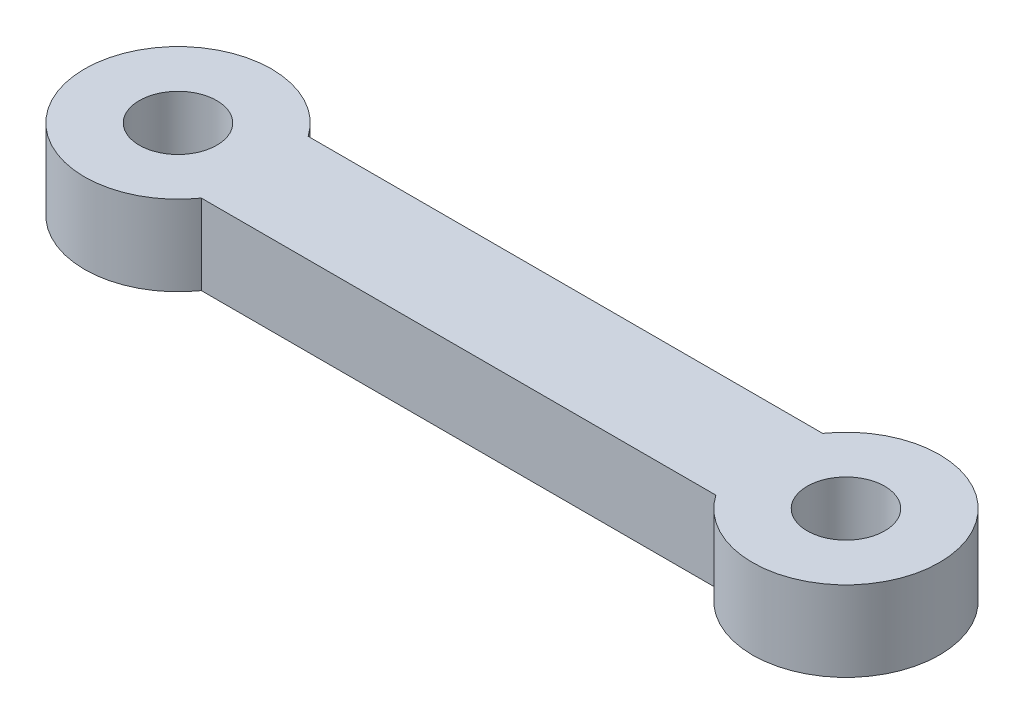
ISO-10303-21;
HEADER;
FILE_DESCRIPTION(('STEP AP214'),'2;1');
FILE_NAME('part.step','',(''),(''),'','','');
FILE_SCHEMA(('AUTOMOTIVE_DESIGN { 1 0 10303 214 1 1 1 1 }'));
ENDSEC;
DATA;
#1=APPLICATION_CONTEXT('core data for automotive mechanical design processes');
#2=APPLICATION_PROTOCOL_DEFINITION('international standard','automotive_design',2000,#1);
#3=PRODUCT_CONTEXT('',#1,'mechanical');
#4=PRODUCT('Part','Part','',(#3));
#5=PRODUCT_RELATED_PRODUCT_CATEGORY('part','',(#4));
#6=PRODUCT_DEFINITION_FORMATION('','',#4);
#7=PRODUCT_DEFINITION_CONTEXT('part definition',#1,'design');
#8=PRODUCT_DEFINITION('design','',#6,#7);
#9=PRODUCT_DEFINITION_SHAPE('','',#8);
#10=(LENGTH_UNIT() NAMED_UNIT(*) SI_UNIT(.MILLI.,.METRE.));
#11=(NAMED_UNIT(*) PLANE_ANGLE_UNIT() SI_UNIT($,.RADIAN.));
#12=(NAMED_UNIT(*) SI_UNIT($,.STERADIAN.) SOLID_ANGLE_UNIT());
#13=UNCERTAINTY_MEASURE_WITH_UNIT(LENGTH_MEASURE(1.E-05),#10,'distance_accuracy_value','');
#14=(GEOMETRIC_REPRESENTATION_CONTEXT(3) GLOBAL_UNCERTAINTY_ASSIGNED_CONTEXT((#13)) GLOBAL_UNIT_ASSIGNED_CONTEXT((#10,
#11,#12)) REPRESENTATION_CONTEXT('',''));
#15=CARTESIAN_POINT('',(0.,0.,0.));
#16=DIRECTION('',(0.,0.,1.));
#17=DIRECTION('',(1.,0.,0.));
#18=AXIS2_PLACEMENT_3D('',#15,#16,#17);
#19=CARTESIAN_POINT('',(0.,3.81,2.54));
#20=DIRECTION('',(0.,0.,-1.));
#21=DIRECTION('',(-1.,0.,0.));
#22=AXIS2_PLACEMENT_3D('',#19,#20,#21);
#23=PLANE('',#22);
#24=DIRECTION('',(1.,0.,0.));
#25=VECTOR('',#24,1.);
#26=CARTESIAN_POINT('',(0.,0.,2.54));
#27=LINE('',#26,#25);
#28=CARTESIAN_POINT('',(3.64779728055165,0.,2.54));
#29=VERTEX_POINT('',#28);
#30=CARTESIAN_POINT('',(28.1022027194484,0.,2.54));
#31=VERTEX_POINT('',#30);
#32=EDGE_CURVE('E105',#29,#31,#27,.T.);
#33=ORIENTED_EDGE('',*,*,#32,.T.);
#34=DIRECTION('',(0.,-1.,0.));
#35=VECTOR('',#34,1.);
#36=CARTESIAN_POINT('',(28.1022027194484,3.81,2.54));
#37=LINE('',#36,#35);
#38=CARTESIAN_POINT('',(28.1022027194484,3.81,2.54));
#39=VERTEX_POINT('',#38);
#40=EDGE_CURVE('E11',#39,#31,#37,.T.);
#41=ORIENTED_EDGE('',*,*,#40,.F.);
#42=DIRECTION('',(1.,0.,0.));
#43=VECTOR('',#42,1.);
#44=CARTESIAN_POINT('',(0.,3.81,2.54));
#45=LINE('',#44,#43);
#46=CARTESIAN_POINT('',(3.64779728055165,3.81,2.54));
#47=VERTEX_POINT('',#46);
#48=EDGE_CURVE('E84',#47,#39,#45,.T.);
#49=ORIENTED_EDGE('',*,*,#48,.F.);
#50=DIRECTION('',(0.,-1.,0.));
#51=VECTOR('',#50,1.);
#52=CARTESIAN_POINT('',(3.64779728055165,3.81,2.54));
#53=LINE('',#52,#51);
#54=EDGE_CURVE('E95',#47,#29,#53,.T.);
#55=ORIENTED_EDGE('',*,*,#54,.T.);
#56=EDGE_LOOP('',(#33,#41,#49,#55));
#57=FACE_BOUND('',#56,.T.);
#58=ADVANCED_FACE('F36',(#57),#23,.F.);
#59=CARTESIAN_POINT('',(31.75,3.81,0.));
#60=DIRECTION('',(0.,-1.,0.));
#61=DIRECTION('',(0.,0.,-1.));
#62=AXIS2_PLACEMENT_3D('',#59,#60,#61);
#63=CYLINDRICAL_SURFACE('',#62,4.445);
#64=CARTESIAN_POINT('',(31.75,0.,0.));
#65=DIRECTION('',(0.,1.,0.));
#66=DIRECTION('',(0.,0.,1.));
#67=AXIS2_PLACEMENT_3D('',#64,#65,#66);
#68=CIRCLE('',#67,4.445);
#69=CARTESIAN_POINT('',(28.1022027194484,0.,-2.54));
#70=VERTEX_POINT('',#69);
#71=EDGE_CURVE('E89',#31,#70,#68,.T.);
#72=ORIENTED_EDGE('',*,*,#71,.T.);
#73=DIRECTION('',(0.,-1.,0.));
#74=VECTOR('',#73,1.);
#75=CARTESIAN_POINT('',(28.1022027194484,3.81,-2.54));
#76=LINE('',#75,#74);
#77=CARTESIAN_POINT('',(28.1022027194484,3.81,-2.54));
#78=VERTEX_POINT('',#77);
#79=EDGE_CURVE('E45',#78,#70,#76,.T.);
#80=ORIENTED_EDGE('',*,*,#79,.F.);
#81=CARTESIAN_POINT('',(31.75,3.81,0.));
#82=DIRECTION('',(0.,1.,0.));
#83=DIRECTION('',(0.,0.,1.));
#84=AXIS2_PLACEMENT_3D('',#81,#82,#83);
#85=CIRCLE('',#84,4.445);
#86=EDGE_CURVE('E79',#39,#78,#85,.T.);
#87=ORIENTED_EDGE('',*,*,#86,.F.);
#88=ORIENTED_EDGE('',*,*,#40,.T.);
#89=EDGE_LOOP('',(#72,#80,#87,#88));
#90=FACE_BOUND('',#89,.T.);
#91=ADVANCED_FACE('F88',(#90),#63,.T.);
#92=CARTESIAN_POINT('',(0.,3.81,-2.54));
#93=DIRECTION('',(0.,0.,-1.));
#94=DIRECTION('',(-1.,0.,0.));
#95=AXIS2_PLACEMENT_3D('',#92,#93,#94);
#96=PLANE('',#95);
#97=DIRECTION('',(1.,0.,0.));
#98=VECTOR('',#97,1.);
#99=CARTESIAN_POINT('',(0.,0.,-2.54));
#100=LINE('',#99,#98);
#101=CARTESIAN_POINT('',(3.64779728055165,0.,-2.54));
#102=VERTEX_POINT('',#101);
#103=EDGE_CURVE('E109',#102,#70,#100,.T.);
#104=ORIENTED_EDGE('',*,*,#103,.F.);
#105=DIRECTION('',(0.,-1.,0.));
#106=VECTOR('',#105,1.);
#107=CARTESIAN_POINT('',(3.64779728055165,3.81,-2.54));
#108=LINE('',#107,#106);
#109=CARTESIAN_POINT('',(3.64779728055165,3.81,-2.54));
#110=VERTEX_POINT('',#109);
#111=EDGE_CURVE('E69',#110,#102,#108,.T.);
#112=ORIENTED_EDGE('',*,*,#111,.F.);
#113=DIRECTION('',(1.,0.,0.));
#114=VECTOR('',#113,1.);
#115=CARTESIAN_POINT('',(0.,3.81,-2.54));
#116=LINE('',#115,#114);
#117=EDGE_CURVE('E82',#110,#78,#116,.T.);
#118=ORIENTED_EDGE('',*,*,#117,.T.);
#119=ORIENTED_EDGE('',*,*,#79,.T.);
#120=EDGE_LOOP('',(#104,#112,#118,#119));
#121=FACE_BOUND('',#120,.T.);
#122=ADVANCED_FACE('F93',(#121),#96,.T.);
#123=CARTESIAN_POINT('',(0.,3.81,0.));
#124=DIRECTION('',(0.,-1.,0.));
#125=DIRECTION('',(0.,0.,-1.));
#126=AXIS2_PLACEMENT_3D('',#123,#124,#125);
#127=CYLINDRICAL_SURFACE('',#126,1.8415);
#128=CARTESIAN_POINT('',(0.,3.81,0.));
#129=DIRECTION('',(0.,1.,0.));
#130=DIRECTION('',(0.,0.,1.));
#131=AXIS2_PLACEMENT_3D('',#128,#129,#130);
#132=CIRCLE('',#131,1.8415);
#133=CARTESIAN_POINT('',(0.,3.81,-1.8415));
#134=VERTEX_POINT('',#133);
#135=EDGE_CURVE('E147',#134,#134,#132,.T.);
#136=CARTESIAN_POINT('',(0.,0.,0.));
#137=DIRECTION('',(0.,1.,0.));
#138=DIRECTION('',(0.,0.,1.));
#139=AXIS2_PLACEMENT_3D('',#136,#137,#138);
#140=CIRCLE('',#139,1.8415);
#141=CARTESIAN_POINT('',(0.,0.,-1.8415));
#142=VERTEX_POINT('',#141);
#143=EDGE_CURVE('E102',#142,#142,#140,.T.);
#144=CARTESIAN_POINT('',(0.,3.81,-1.8415));
#145=CARTESIAN_POINT('',(0.,3.7703125,-1.8415));
#146=CARTESIAN_POINT('',(0.,3.730625,-1.8415));
#147=CARTESIAN_POINT('',(0.,3.65125,-1.8415));
#148=CARTESIAN_POINT('',(0.,3.6115625,-1.8415));
#149=CARTESIAN_POINT('',(0.,3.5321875,-1.8415));
#150=CARTESIAN_POINT('',(0.,3.4925,-1.8415));
#151=CARTESIAN_POINT('',(0.,3.413125,-1.8415));
#152=CARTESIAN_POINT('',(0.,3.3734375,-1.8415));
#153=CARTESIAN_POINT('',(0.,3.2940625,-1.8415));
#154=CARTESIAN_POINT('',(0.,3.254375,-1.8415));
#155=CARTESIAN_POINT('',(0.,3.175,-1.8415));
#156=CARTESIAN_POINT('',(0.,3.1353125,-1.8415));
#157=CARTESIAN_POINT('',(0.,3.0559375,-1.8415));
#158=CARTESIAN_POINT('',(0.,3.01625,-1.8415));
#159=CARTESIAN_POINT('',(0.,2.936875,-1.8415));
#160=CARTESIAN_POINT('',(0.,2.8971875,-1.8415));
#161=CARTESIAN_POINT('',(0.,2.8178125,-1.8415));
#162=CARTESIAN_POINT('',(0.,2.778125,-1.8415));
#163=CARTESIAN_POINT('',(0.,2.69875,-1.8415));
#164=CARTESIAN_POINT('',(0.,2.6590625,-1.8415));
#165=CARTESIAN_POINT('',(0.,2.5796875,-1.8415));
#166=CARTESIAN_POINT('',(0.,2.54,-1.8415));
#167=CARTESIAN_POINT('',(0.,2.460625,-1.8415));
#168=CARTESIAN_POINT('',(0.,2.4209375,-1.8415));
#169=CARTESIAN_POINT('',(0.,2.3415625,-1.8415));
#170=CARTESIAN_POINT('',(0.,2.301875,-1.8415));
#171=CARTESIAN_POINT('',(0.,2.2225,-1.8415));
#172=CARTESIAN_POINT('',(0.,2.1828125,-1.8415));
#173=CARTESIAN_POINT('',(0.,2.1034375,-1.8415));
#174=CARTESIAN_POINT('',(0.,2.06375,-1.8415));
#175=CARTESIAN_POINT('',(0.,1.984375,-1.8415));
#176=CARTESIAN_POINT('',(0.,1.9446875,-1.8415));
#177=CARTESIAN_POINT('',(0.,1.8653125,-1.8415));
#178=CARTESIAN_POINT('',(0.,1.825625,-1.8415));
#179=CARTESIAN_POINT('',(0.,1.74625,-1.8415));
#180=CARTESIAN_POINT('',(0.,1.7065625,-1.8415));
#181=CARTESIAN_POINT('',(0.,1.6271875,-1.8415));
#182=CARTESIAN_POINT('',(0.,1.5875,-1.8415));
#183=CARTESIAN_POINT('',(0.,1.508125,-1.8415));
#184=CARTESIAN_POINT('',(0.,1.4684375,-1.8415));
#185=CARTESIAN_POINT('',(0.,1.3890625,-1.8415));
#186=CARTESIAN_POINT('',(0.,1.349375,-1.8415));
#187=CARTESIAN_POINT('',(0.,1.27,-1.8415));
#188=CARTESIAN_POINT('',(0.,1.2303125,-1.8415));
#189=CARTESIAN_POINT('',(0.,1.1509375,-1.8415));
#190=CARTESIAN_POINT('',(0.,1.11125,-1.8415));
#191=CARTESIAN_POINT('',(0.,1.031875,-1.8415));
#192=CARTESIAN_POINT('',(0.,0.9921875,-1.8415));
#193=CARTESIAN_POINT('',(0.,0.9128125,-1.8415));
#194=CARTESIAN_POINT('',(0.,0.873125,-1.8415));
#195=CARTESIAN_POINT('',(0.,0.79375,-1.8415));
#196=CARTESIAN_POINT('',(0.,0.7540625,-1.8415));
#197=CARTESIAN_POINT('',(0.,0.6746875,-1.8415));
#198=CARTESIAN_POINT('',(0.,0.635,-1.8415));
#199=CARTESIAN_POINT('',(0.,0.555625,-1.8415));
#200=CARTESIAN_POINT('',(0.,0.5159375,-1.8415));
#201=CARTESIAN_POINT('',(0.,0.4365625,-1.8415));
#202=CARTESIAN_POINT('',(0.,0.396875,-1.8415));
#203=CARTESIAN_POINT('',(0.,0.3175,-1.8415));
#204=CARTESIAN_POINT('',(0.,0.2778125,-1.8415));
#205=CARTESIAN_POINT('',(0.,0.1984375,-1.8415));
#206=CARTESIAN_POINT('',(0.,0.15875,-1.8415));
#207=CARTESIAN_POINT('',(0.,0.0793749999999999,-1.8415));
#208=CARTESIAN_POINT('',(0.,0.0396874999999999,-1.8415));
#209=CARTESIAN_POINT('',(0.,0.,-1.8415));
#210=B_SPLINE_CURVE_WITH_KNOTS('',3,(#144,#145,#146,#147,#148,#149,#150,#151,#152,#153,#154,
#155,#156,#157,#158,#159,#160,#161,#162,#163,#164,#165,#166,#167,#168,#169,#170,#171,#172,#173,
#174,#175,#176,#177,#178,#179,#180,#181,#182,#183,#184,#185,#186,#187,#188,#189,#190,#191,#192,
#193,#194,#195,#196,#197,#198,#199,#200,#201,#202,#203,#204,#205,#206,#207,#208,#209),
.UNSPECIFIED.,.F.,.F.,(4,2,2,2,2,2,2,2,2,2,2,2,2,2,2,2,2,2,2,2,2,2,2,2,2,2,2,2,2,2,2,2,4),(0.,
0.1190625,0.238125,0.3571875,0.47625,0.5953125,0.714375,0.8334375,0.9525,1.0715625,1.190625,
1.3096875,1.42875,1.5478125,1.666875,1.7859375,1.905,2.0240625,2.143125,2.2621875,2.38125,
2.5003125,2.619375,2.7384375,2.8575,2.9765625,3.095625,3.2146875,3.33375,3.4528125,3.571875,
3.6909375,3.81),.UNSPECIFIED.);
#211=EDGE_CURVE('BSEAM136',#134,#142,#210,.T.);
#212=ORIENTED_EDGE('',*,*,#135,.T.);
#213=ORIENTED_EDGE('',*,*,#143,.F.);
#214=ORIENTED_EDGE('',*,*,#211,.T.);
#215=ORIENTED_EDGE('',*,*,#211,.F.);
#216=EDGE_LOOP('',(#212,#214,#213,#215));
#217=FACE_BOUND('',#216,.T.);
#218=ADVANCED_FACE('F136',(#217),#127,.F.);
#219=CARTESIAN_POINT('',(31.75,3.81,0.));
#220=DIRECTION('',(0.,-1.,0.));
#221=DIRECTION('',(0.,0.,-1.));
#222=AXIS2_PLACEMENT_3D('',#219,#220,#221);
#223=CYLINDRICAL_SURFACE('',#222,1.8415);
#224=CARTESIAN_POINT('',(31.75,3.81,0.));
#225=DIRECTION('',(0.,1.,0.));
#226=DIRECTION('',(0.,0.,1.));
#227=AXIS2_PLACEMENT_3D('',#224,#225,#226);
#228=CIRCLE('',#227,1.8415);
#229=CARTESIAN_POINT('',(31.75,3.81,-1.8415));
#230=VERTEX_POINT('',#229);
#231=EDGE_CURVE('E112',#230,#230,#228,.T.);
#232=CARTESIAN_POINT('',(31.75,0.,0.));
#233=DIRECTION('',(0.,1.,0.));
#234=DIRECTION('',(0.,0.,1.));
#235=AXIS2_PLACEMENT_3D('',#232,#233,#234);
#236=CIRCLE('',#235,1.8415);
#237=CARTESIAN_POINT('',(31.75,0.,-1.8415));
#238=VERTEX_POINT('',#237);
#239=EDGE_CURVE('E99',#238,#238,#236,.T.);
#240=CARTESIAN_POINT('',(31.75,3.81,-1.8415));
#241=CARTESIAN_POINT('',(31.75,3.7703125,-1.8415));
#242=CARTESIAN_POINT('',(31.75,3.730625,-1.8415));
#243=CARTESIAN_POINT('',(31.75,3.65125,-1.8415));
#244=CARTESIAN_POINT('',(31.75,3.6115625,-1.8415));
#245=CARTESIAN_POINT('',(31.75,3.5321875,-1.8415));
#246=CARTESIAN_POINT('',(31.75,3.4925,-1.8415));
#247=CARTESIAN_POINT('',(31.75,3.413125,-1.8415));
#248=CARTESIAN_POINT('',(31.75,3.3734375,-1.8415));
#249=CARTESIAN_POINT('',(31.75,3.2940625,-1.8415));
#250=CARTESIAN_POINT('',(31.75,3.254375,-1.8415));
#251=CARTESIAN_POINT('',(31.75,3.175,-1.8415));
#252=CARTESIAN_POINT('',(31.75,3.1353125,-1.8415));
#253=CARTESIAN_POINT('',(31.75,3.0559375,-1.8415));
#254=CARTESIAN_POINT('',(31.75,3.01625,-1.8415));
#255=CARTESIAN_POINT('',(31.75,2.936875,-1.8415));
#256=CARTESIAN_POINT('',(31.75,2.8971875,-1.8415));
#257=CARTESIAN_POINT('',(31.75,2.8178125,-1.8415));
#258=CARTESIAN_POINT('',(31.75,2.778125,-1.8415));
#259=CARTESIAN_POINT('',(31.75,2.69875,-1.8415));
#260=CARTESIAN_POINT('',(31.75,2.6590625,-1.8415));
#261=CARTESIAN_POINT('',(31.75,2.5796875,-1.8415));
#262=CARTESIAN_POINT('',(31.75,2.54,-1.8415));
#263=CARTESIAN_POINT('',(31.75,2.460625,-1.8415));
#264=CARTESIAN_POINT('',(31.75,2.4209375,-1.8415));
#265=CARTESIAN_POINT('',(31.75,2.3415625,-1.8415));
#266=CARTESIAN_POINT('',(31.75,2.301875,-1.8415));
#267=CARTESIAN_POINT('',(31.75,2.2225,-1.8415));
#268=CARTESIAN_POINT('',(31.75,2.1828125,-1.8415));
#269=CARTESIAN_POINT('',(31.75,2.1034375,-1.8415));
#270=CARTESIAN_POINT('',(31.75,2.06375,-1.8415));
#271=CARTESIAN_POINT('',(31.75,1.984375,-1.8415));
#272=CARTESIAN_POINT('',(31.75,1.9446875,-1.8415));
#273=CARTESIAN_POINT('',(31.75,1.8653125,-1.8415));
#274=CARTESIAN_POINT('',(31.75,1.825625,-1.8415));
#275=CARTESIAN_POINT('',(31.75,1.74625,-1.8415));
#276=CARTESIAN_POINT('',(31.75,1.7065625,-1.8415));
#277=CARTESIAN_POINT('',(31.75,1.6271875,-1.8415));
#278=CARTESIAN_POINT('',(31.75,1.5875,-1.8415));
#279=CARTESIAN_POINT('',(31.75,1.508125,-1.8415));
#280=CARTESIAN_POINT('',(31.75,1.4684375,-1.8415));
#281=CARTESIAN_POINT('',(31.75,1.3890625,-1.8415));
#282=CARTESIAN_POINT('',(31.75,1.349375,-1.8415));
#283=CARTESIAN_POINT('',(31.75,1.27,-1.8415));
#284=CARTESIAN_POINT('',(31.75,1.2303125,-1.8415));
#285=CARTESIAN_POINT('',(31.75,1.1509375,-1.8415));
#286=CARTESIAN_POINT('',(31.75,1.11125,-1.8415));
#287=CARTESIAN_POINT('',(31.75,1.031875,-1.8415));
#288=CARTESIAN_POINT('',(31.75,0.9921875,-1.8415));
#289=CARTESIAN_POINT('',(31.75,0.9128125,-1.8415));
#290=CARTESIAN_POINT('',(31.75,0.873125,-1.8415));
#291=CARTESIAN_POINT('',(31.75,0.79375,-1.8415));
#292=CARTESIAN_POINT('',(31.75,0.7540625,-1.8415));
#293=CARTESIAN_POINT('',(31.75,0.6746875,-1.8415));
#294=CARTESIAN_POINT('',(31.75,0.635,-1.8415));
#295=CARTESIAN_POINT('',(31.75,0.555625,-1.8415));
#296=CARTESIAN_POINT('',(31.75,0.5159375,-1.8415));
#297=CARTESIAN_POINT('',(31.75,0.4365625,-1.8415));
#298=CARTESIAN_POINT('',(31.75,0.396875,-1.8415));
#299=CARTESIAN_POINT('',(31.75,0.3175,-1.8415));
#300=CARTESIAN_POINT('',(31.75,0.2778125,-1.8415));
#301=CARTESIAN_POINT('',(31.75,0.1984375,-1.8415));
#302=CARTESIAN_POINT('',(31.75,0.15875,-1.8415));
#303=CARTESIAN_POINT('',(31.75,0.0793749999999999,-1.8415));
#304=CARTESIAN_POINT('',(31.75,0.0396874999999999,-1.8415));
#305=CARTESIAN_POINT('',(31.75,0.,-1.8415));
#306=B_SPLINE_CURVE_WITH_KNOTS('',3,(#240,#241,#242,#243,#244,#245,#246,#247,#248,#249,#250,
#251,#252,#253,#254,#255,#256,#257,#258,#259,#260,#261,#262,#263,#264,#265,#266,#267,#268,#269,
#270,#271,#272,#273,#274,#275,#276,#277,#278,#279,#280,#281,#282,#283,#284,#285,#286,#287,#288,
#289,#290,#291,#292,#293,#294,#295,#296,#297,#298,#299,#300,#301,#302,#303,#304,#305),
.UNSPECIFIED.,.F.,.F.,(4,2,2,2,2,2,2,2,2,2,2,2,2,2,2,2,2,2,2,2,2,2,2,2,2,2,2,2,2,2,2,2,4),(0.,
0.1190625,0.238125,0.3571875,0.47625,0.5953125,0.714375,0.8334375,0.9525,1.0715625,1.190625,
1.3096875,1.42875,1.5478125,1.666875,1.7859375,1.905,2.0240625,2.143125,2.2621875,2.38125,
2.5003125,2.619375,2.7384375,2.8575,2.9765625,3.095625,3.2146875,3.33375,3.4528125,3.571875,
3.6909375,3.81),.UNSPECIFIED.);
#307=EDGE_CURVE('BSEAM38',#230,#238,#306,.T.);
#308=ORIENTED_EDGE('',*,*,#231,.T.);
#309=ORIENTED_EDGE('',*,*,#239,.F.);
#310=ORIENTED_EDGE('',*,*,#307,.T.);
#311=ORIENTED_EDGE('',*,*,#307,.F.);
#312=EDGE_LOOP('',(#308,#310,#309,#311));
#313=FACE_BOUND('',#312,.T.);
#314=ADVANCED_FACE('F38',(#313),#223,.F.);
#315=CARTESIAN_POINT('',(0.,3.81,0.));
#316=DIRECTION('',(0.,-1.,0.));
#317=DIRECTION('',(0.,0.,-1.));
#318=AXIS2_PLACEMENT_3D('',#315,#316,#317);
#319=CYLINDRICAL_SURFACE('',#318,4.445);
#320=CARTESIAN_POINT('',(0.,0.,0.));
#321=DIRECTION('',(0.,1.,0.));
#322=DIRECTION('',(0.,0.,1.));
#323=AXIS2_PLACEMENT_3D('',#320,#321,#322);
#324=CIRCLE('',#323,4.445);
#325=EDGE_CURVE('E72',#102,#29,#324,.T.);
#326=ORIENTED_EDGE('',*,*,#325,.T.);
#327=ORIENTED_EDGE('',*,*,#54,.F.);
#328=CARTESIAN_POINT('',(0.,3.81,0.));
#329=DIRECTION('',(0.,1.,0.));
#330=DIRECTION('',(0.,0.,1.));
#331=AXIS2_PLACEMENT_3D('',#328,#329,#330);
#332=CIRCLE('',#331,4.445);
#333=EDGE_CURVE('E53',#110,#47,#332,.T.);
#334=ORIENTED_EDGE('',*,*,#333,.F.);
#335=ORIENTED_EDGE('',*,*,#111,.T.);
#336=EDGE_LOOP('',(#326,#327,#334,#335));
#337=FACE_BOUND('',#336,.T.);
#338=ADVANCED_FACE('F124',(#337),#319,.T.);
#339=CARTESIAN_POINT('',(0.,3.81,0.));
#340=DIRECTION('',(0.,1.,0.));
#341=DIRECTION('',(0.,0.,1.));
#342=AXIS2_PLACEMENT_3D('',#339,#340,#341);
#343=PLANE('',#342);
#344=ORIENTED_EDGE('',*,*,#231,.F.);
#345=EDGE_LOOP('',(#344));
#346=FACE_BOUND('',#345,.T.);
#347=ORIENTED_EDGE('',*,*,#135,.F.);
#348=EDGE_LOOP('',(#347));
#349=FACE_BOUND('',#348,.T.);
#350=ORIENTED_EDGE('',*,*,#48,.T.);
#351=ORIENTED_EDGE('',*,*,#86,.T.);
#352=ORIENTED_EDGE('',*,*,#117,.F.);
#353=ORIENTED_EDGE('',*,*,#333,.T.);
#354=EDGE_LOOP('',(#350,#351,#352,#353));
#355=FACE_BOUND('',#354,.T.);
#356=ADVANCED_FACE('F80',(#346,#349,#355),#343,.T.);
#357=CARTESIAN_POINT('',(0.,0.,0.));
#358=DIRECTION('',(0.,1.,0.));
#359=DIRECTION('',(0.,0.,1.));
#360=AXIS2_PLACEMENT_3D('',#357,#358,#359);
#361=PLANE('',#360);
#362=ORIENTED_EDGE('',*,*,#239,.T.);
#363=EDGE_LOOP('',(#362));
#364=FACE_BOUND('',#363,.T.);
#365=ORIENTED_EDGE('',*,*,#143,.T.);
#366=EDGE_LOOP('',(#365));
#367=FACE_BOUND('',#366,.T.);
#368=ORIENTED_EDGE('',*,*,#32,.F.);
#369=ORIENTED_EDGE('',*,*,#325,.F.);
#370=ORIENTED_EDGE('',*,*,#103,.T.);
#371=ORIENTED_EDGE('',*,*,#71,.F.);
#372=EDGE_LOOP('',(#368,#369,#370,#371));
#373=FACE_BOUND('',#372,.T.);
#374=ADVANCED_FACE('F117',(#364,#367,#373),#361,.F.);
#375=CLOSED_SHELL('',(#58,#91,#122,#218,#314,#338,#356,#374));
#376=MANIFOLD_SOLID_BREP('B2',#375);
#377=ADVANCED_BREP_SHAPE_REPRESENTATION('',(#18,#376),#14);
#378=SHAPE_DEFINITION_REPRESENTATION(#9,#377);
ENDSEC;
END-ISO-10303-21;
